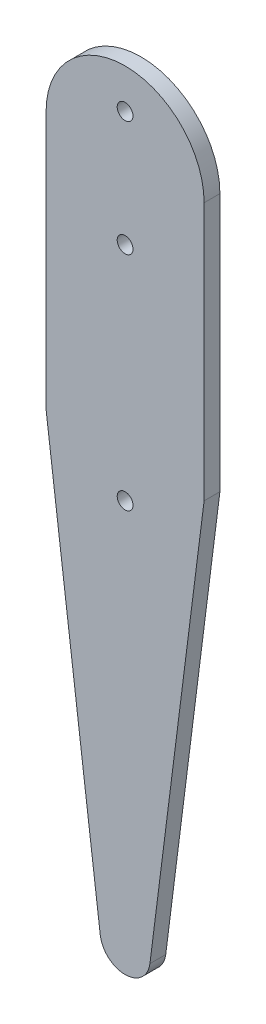
ISO-10303-21;
HEADER;
FILE_DESCRIPTION(('STEP AP214'),'2;1');
FILE_NAME('part.step','',(''),(''),'','','');
FILE_SCHEMA(('AUTOMOTIVE_DESIGN { 1 0 10303 214 1 1 1 1 }'));
ENDSEC;
DATA;
#1=APPLICATION_CONTEXT('core data for automotive mechanical design processes');
#2=APPLICATION_PROTOCOL_DEFINITION('international standard','automotive_design',2000,#1);
#3=PRODUCT_CONTEXT('',#1,'mechanical');
#4=PRODUCT('Part','Part','',(#3));
#5=PRODUCT_RELATED_PRODUCT_CATEGORY('part','',(#4));
#6=PRODUCT_DEFINITION_FORMATION('','',#4);
#7=PRODUCT_DEFINITION_CONTEXT('part definition',#1,'design');
#8=PRODUCT_DEFINITION('design','',#6,#7);
#9=PRODUCT_DEFINITION_SHAPE('','',#8);
#10=(LENGTH_UNIT() NAMED_UNIT(*) SI_UNIT(.MILLI.,.METRE.));
#11=(NAMED_UNIT(*) PLANE_ANGLE_UNIT() SI_UNIT($,.RADIAN.));
#12=(NAMED_UNIT(*) SI_UNIT($,.STERADIAN.) SOLID_ANGLE_UNIT());
#13=UNCERTAINTY_MEASURE_WITH_UNIT(LENGTH_MEASURE(1.E-05),#10,'distance_accuracy_value','');
#14=(GEOMETRIC_REPRESENTATION_CONTEXT(3) GLOBAL_UNCERTAINTY_ASSIGNED_CONTEXT((#13)) GLOBAL_UNIT_ASSIGNED_CONTEXT((#10,
#11,#12)) REPRESENTATION_CONTEXT('',''));
#15=CARTESIAN_POINT('',(0.,0.,0.));
#16=DIRECTION('',(0.,0.,1.));
#17=DIRECTION('',(1.,0.,0.));
#18=AXIS2_PLACEMENT_3D('',#15,#16,#17);
#19=CARTESIAN_POINT('',(9.99999999999545,44.7499999999967,3.));
#20=DIRECTION('',(0.,0.,1.));
#21=DIRECTION('',(1.,0.,0.));
#22=AXIS2_PLACEMENT_3D('',#19,#20,#21);
#23=PLANE('',#22);
#24=CARTESIAN_POINT('',(10.0000000000035,52.2499999999999,3.));
#25=DIRECTION('',(0.,0.,1.));
#26=DIRECTION('',(1.,0.,0.));
#27=AXIS2_PLACEMENT_3D('',#24,#25,#26);
#28=CIRCLE('',#27,1.5);
#29=CARTESIAN_POINT('',(11.5000000000035,52.2499999999999,3.));
#30=VERTEX_POINT('',#29);
#31=EDGE_CURVE('E187',#30,#30,#28,.T.);
#32=ORIENTED_EDGE('',*,*,#31,.F.);
#33=EDGE_LOOP('',(#32));
#34=FACE_BOUND('',#33,.T.);
#35=CARTESIAN_POINT('',(9.99999999999545,44.7499999999967,3.));
#36=DIRECTION('',(0.,0.,1.));
#37=DIRECTION('',(1.,0.,0.));
#38=AXIS2_PLACEMENT_3D('',#35,#36,#37);
#39=CIRCLE('',#38,14.9999999999159);
#40=CARTESIAN_POINT('',(24.999999999834,44.7499999999967,3.));
#41=VERTEX_POINT('',#40);
#42=CARTESIAN_POINT('',(-4.99999999999773,44.7499999999967,3.));
#43=VERTEX_POINT('',#42);
#44=EDGE_CURVE('E131',#41,#43,#39,.T.);
#45=ORIENTED_EDGE('',*,*,#44,.T.);
#46=DIRECTION('',(0.,-1.,0.));
#47=VECTOR('',#46,1.);
#48=CARTESIAN_POINT('',(-4.99999999999773,44.7499999999967,3.));
#49=LINE('',#48,#47);
#50=CARTESIAN_POINT('',(-4.99999999999773,-4.25000000000659,3.));
#51=VERTEX_POINT('',#50);
#52=EDGE_CURVE('E89',#43,#51,#49,.T.);
#53=ORIENTED_EDGE('',*,*,#52,.T.);
#54=DIRECTION('',(0.12563429234926,-0.992076622336148,0.));
#55=VECTOR('',#54,1.);
#56=CARTESIAN_POINT('',(-4.99999999999773,-4.25000000000659,3.));
#57=LINE('',#56,#55);
#58=CARTESIAN_POINT('',(5.28763604390686,-85.4867628886591,3.));
#59=VERTEX_POINT('',#58);
#60=EDGE_CURVE('E102',#51,#59,#57,.T.);
#61=ORIENTED_EDGE('',*,*,#60,.T.);
#62=CARTESIAN_POINT('',(10.0000000000036,-84.89,3.));
#63=DIRECTION('',(0.,0.,1.));
#64=DIRECTION('',(1.,0.,0.));
#65=AXIS2_PLACEMENT_3D('',#62,#63,#64);
#66=CIRCLE('',#65,4.75);
#67=CARTESIAN_POINT('',(14.7123639561003,-85.486762888659,3.));
#68=VERTEX_POINT('',#67);
#69=EDGE_CURVE('E96',#59,#68,#66,.T.);
#70=ORIENTED_EDGE('',*,*,#69,.T.);
#71=DIRECTION('',(0.125634292347198,0.992076622336409,0.));
#72=VECTOR('',#71,1.);
#73=CARTESIAN_POINT('',(24.9999999998328,-4.25000000000989,3.));
#74=LINE('',#73,#72);
#75=CARTESIAN_POINT('',(24.9999999998328,-4.25000000000989,3.));
#76=VERTEX_POINT('',#75);
#77=EDGE_CURVE('E100',#68,#76,#74,.T.);
#78=ORIENTED_EDGE('',*,*,#77,.T.);
#79=DIRECTION('',(0.,1.,0.));
#80=VECTOR('',#79,1.);
#81=CARTESIAN_POINT('',(24.999999999834,44.7499999999967,3.));
#82=LINE('',#81,#80);
#83=EDGE_CURVE('E52',#76,#41,#82,.T.);
#84=ORIENTED_EDGE('',*,*,#83,.T.);
#85=EDGE_LOOP('',(#45,#53,#61,#70,#78,#84));
#86=FACE_BOUND('',#85,.T.);
#87=CARTESIAN_POINT('',(9.99999999999547,30.3600000000009,3.));
#88=DIRECTION('',(0.,0.,1.));
#89=DIRECTION('',(1.,0.,0.));
#90=AXIS2_PLACEMENT_3D('',#87,#88,#89);
#91=CIRCLE('',#90,1.5);
#92=CARTESIAN_POINT('',(11.4999999999955,30.3600000000009,3.));
#93=VERTEX_POINT('',#92);
#94=EDGE_CURVE('E124',#93,#93,#91,.T.);
#95=ORIENTED_EDGE('',*,*,#94,.F.);
#96=EDGE_LOOP('',(#95));
#97=FACE_BOUND('',#96,.T.);
#98=CARTESIAN_POINT('',(10.0000000000035,-11.75,3.));
#99=DIRECTION('',(0.,0.,1.));
#100=DIRECTION('',(1.,0.,0.));
#101=AXIS2_PLACEMENT_3D('',#98,#99,#100);
#102=CIRCLE('',#101,1.5);
#103=CARTESIAN_POINT('',(11.5000000000035,-11.75,3.));
#104=VERTEX_POINT('',#103);
#105=EDGE_CURVE('E178',#104,#104,#102,.T.);
#106=ORIENTED_EDGE('',*,*,#105,.F.);
#107=EDGE_LOOP('',(#106));
#108=FACE_BOUND('',#107,.T.);
#109=ADVANCED_FACE('F35',(#34,#86,#97,#108),#23,.T.);
#110=CARTESIAN_POINT('',(9.99999999999545,44.7499999999967,0.));
#111=DIRECTION('',(0.,0.,1.));
#112=DIRECTION('',(1.,0.,0.));
#113=AXIS2_PLACEMENT_3D('',#110,#111,#112);
#114=PLANE('',#113);
#115=CARTESIAN_POINT('',(10.0000000000035,52.2499999999999,0.));
#116=DIRECTION('',(0.,0.,1.));
#117=DIRECTION('',(1.,0.,0.));
#118=AXIS2_PLACEMENT_3D('',#115,#116,#117);
#119=CIRCLE('',#118,1.5);
#120=CARTESIAN_POINT('',(11.5000000000035,52.2499999999999,0.));
#121=VERTEX_POINT('',#120);
#122=EDGE_CURVE('E184',#121,#121,#119,.T.);
#123=ORIENTED_EDGE('',*,*,#122,.T.);
#124=EDGE_LOOP('',(#123));
#125=FACE_BOUND('',#124,.T.);
#126=CARTESIAN_POINT('',(9.99999999999545,44.7499999999967,0.));
#127=DIRECTION('',(0.,0.,1.));
#128=DIRECTION('',(1.,0.,0.));
#129=AXIS2_PLACEMENT_3D('',#126,#127,#128);
#130=CIRCLE('',#129,14.9999999999159);
#131=CARTESIAN_POINT('',(24.999999999834,44.7499999999967,0.));
#132=VERTEX_POINT('',#131);
#133=CARTESIAN_POINT('',(-4.99999999999773,44.7499999999967,0.));
#134=VERTEX_POINT('',#133);
#135=EDGE_CURVE('E120',#132,#134,#130,.T.);
#136=ORIENTED_EDGE('',*,*,#135,.F.);
#137=DIRECTION('',(0.,1.,0.));
#138=VECTOR('',#137,1.);
#139=CARTESIAN_POINT('',(24.999999999834,44.7499999999967,0.));
#140=LINE('',#139,#138);
#141=CARTESIAN_POINT('',(24.9999999998328,-4.25000000000989,0.));
#142=VERTEX_POINT('',#141);
#143=EDGE_CURVE('E81',#142,#132,#140,.T.);
#144=ORIENTED_EDGE('',*,*,#143,.F.);
#145=DIRECTION('',(0.125634292347198,0.992076622336409,0.));
#146=VECTOR('',#145,1.);
#147=CARTESIAN_POINT('',(24.9999999998328,-4.25000000000989,0.));
#148=LINE('',#147,#146);
#149=CARTESIAN_POINT('',(14.7123639561003,-85.486762888659,0.));
#150=VERTEX_POINT('',#149);
#151=EDGE_CURVE('E75',#150,#142,#148,.T.);
#152=ORIENTED_EDGE('',*,*,#151,.F.);
#153=CARTESIAN_POINT('',(10.0000000000036,-84.89,0.));
#154=DIRECTION('',(0.,0.,1.));
#155=DIRECTION('',(1.,0.,0.));
#156=AXIS2_PLACEMENT_3D('',#153,#154,#155);
#157=CIRCLE('',#156,4.75);
#158=CARTESIAN_POINT('',(5.28763604390686,-85.4867628886591,0.));
#159=VERTEX_POINT('',#158);
#160=EDGE_CURVE('E110',#159,#150,#157,.T.);
#161=ORIENTED_EDGE('',*,*,#160,.F.);
#162=DIRECTION('',(0.12563429234926,-0.992076622336148,0.));
#163=VECTOR('',#162,1.);
#164=CARTESIAN_POINT('',(-4.99999999999773,-4.25000000000659,0.));
#165=LINE('',#164,#163);
#166=CARTESIAN_POINT('',(-4.99999999999773,-4.25000000000659,0.));
#167=VERTEX_POINT('',#166);
#168=EDGE_CURVE('E126',#167,#159,#165,.T.);
#169=ORIENTED_EDGE('',*,*,#168,.F.);
#170=DIRECTION('',(0.,-1.,0.));
#171=VECTOR('',#170,1.);
#172=CARTESIAN_POINT('',(-4.99999999999773,44.7499999999967,0.));
#173=LINE('',#172,#171);
#174=EDGE_CURVE('E123',#134,#167,#173,.T.);
#175=ORIENTED_EDGE('',*,*,#174,.F.);
#176=EDGE_LOOP('',(#136,#144,#152,#161,#169,#175));
#177=FACE_BOUND('',#176,.T.);
#178=CARTESIAN_POINT('',(9.99999999999547,30.3600000000009,0.));
#179=DIRECTION('',(0.,0.,1.));
#180=DIRECTION('',(1.,0.,0.));
#181=AXIS2_PLACEMENT_3D('',#178,#179,#180);
#182=CIRCLE('',#181,1.5);
#183=CARTESIAN_POINT('',(11.4999999999955,30.3600000000009,0.));
#184=VERTEX_POINT('',#183);
#185=EDGE_CURVE('E190',#184,#184,#182,.T.);
#186=ORIENTED_EDGE('',*,*,#185,.T.);
#187=EDGE_LOOP('',(#186));
#188=FACE_BOUND('',#187,.T.);
#189=CARTESIAN_POINT('',(10.0000000000035,-11.75,0.));
#190=DIRECTION('',(0.,0.,1.));
#191=DIRECTION('',(1.,0.,0.));
#192=AXIS2_PLACEMENT_3D('',#189,#190,#191);
#193=CIRCLE('',#192,1.5);
#194=CARTESIAN_POINT('',(11.5000000000035,-11.75,0.));
#195=VERTEX_POINT('',#194);
#196=EDGE_CURVE('E181',#195,#195,#193,.T.);
#197=ORIENTED_EDGE('',*,*,#196,.T.);
#198=EDGE_LOOP('',(#197));
#199=FACE_BOUND('',#198,.T.);
#200=ADVANCED_FACE('F140',(#125,#177,#188,#199),#114,.F.);
#201=CARTESIAN_POINT('',(9.99999999999545,44.7499999999967,3.));
#202=DIRECTION('',(0.,0.,-1.));
#203=DIRECTION('',(-1.,0.,0.));
#204=AXIS2_PLACEMENT_3D('',#201,#202,#203);
#205=CYLINDRICAL_SURFACE('',#204,14.9999999999159);
#206=ORIENTED_EDGE('',*,*,#135,.T.);
#207=DIRECTION('',(0.,0.,-1.));
#208=VECTOR('',#207,1.);
#209=CARTESIAN_POINT('',(-4.99999999999773,44.7499999999967,3.));
#210=LINE('',#209,#208);
#211=EDGE_CURVE('E11',#43,#134,#210,.T.);
#212=ORIENTED_EDGE('',*,*,#211,.F.);
#213=ORIENTED_EDGE('',*,*,#44,.F.);
#214=DIRECTION('',(0.,0.,-1.));
#215=VECTOR('',#214,1.);
#216=CARTESIAN_POINT('',(24.999999999834,44.7499999999967,3.));
#217=LINE('',#216,#215);
#218=EDGE_CURVE('E116',#41,#132,#217,.T.);
#219=ORIENTED_EDGE('',*,*,#218,.T.);
#220=EDGE_LOOP('',(#206,#212,#213,#219));
#221=FACE_BOUND('',#220,.T.);
#222=ADVANCED_FACE('F37',(#221),#205,.T.);
#223=CARTESIAN_POINT('',(-4.99999999999773,44.7499999999967,3.));
#224=DIRECTION('',(1.,0.,0.));
#225=DIRECTION('',(0.,0.,-1.));
#226=AXIS2_PLACEMENT_3D('',#223,#224,#225);
#227=PLANE('',#226);
#228=ORIENTED_EDGE('',*,*,#174,.T.);
#229=DIRECTION('',(0.,0.,-1.));
#230=VECTOR('',#229,1.);
#231=CARTESIAN_POINT('',(-4.99999999999773,-4.25000000000659,3.));
#232=LINE('',#231,#230);
#233=EDGE_CURVE('E44',#51,#167,#232,.T.);
#234=ORIENTED_EDGE('',*,*,#233,.F.);
#235=ORIENTED_EDGE('',*,*,#52,.F.);
#236=ORIENTED_EDGE('',*,*,#211,.T.);
#237=EDGE_LOOP('',(#228,#234,#235,#236));
#238=FACE_BOUND('',#237,.T.);
#239=ADVANCED_FACE('F239',(#238),#227,.F.);
#240=CARTESIAN_POINT('',(-4.99999999999773,-4.25000000000659,3.));
#241=DIRECTION('',(0.992076622336148,0.12563429234926,0.));
#242=DIRECTION('',(-0.12563429234926,0.992076622336148,0.));
#243=AXIS2_PLACEMENT_3D('',#240,#241,#242);
#244=PLANE('',#243);
#245=ORIENTED_EDGE('',*,*,#168,.T.);
#246=DIRECTION('',(0.,0.,-1.));
#247=VECTOR('',#246,1.);
#248=CARTESIAN_POINT('',(5.28763604390686,-85.4867628886591,3.));
#249=LINE('',#248,#247);
#250=EDGE_CURVE('E111',#59,#159,#249,.T.);
#251=ORIENTED_EDGE('',*,*,#250,.F.);
#252=ORIENTED_EDGE('',*,*,#60,.F.);
#253=ORIENTED_EDGE('',*,*,#233,.T.);
#254=EDGE_LOOP('',(#245,#251,#252,#253));
#255=FACE_BOUND('',#254,.T.);
#256=ADVANCED_FACE('F137',(#255),#244,.F.);
#257=CARTESIAN_POINT('',(10.0000000000036,-84.89,3.));
#258=DIRECTION('',(0.,0.,-1.));
#259=DIRECTION('',(-1.,0.,0.));
#260=AXIS2_PLACEMENT_3D('',#257,#258,#259);
#261=CYLINDRICAL_SURFACE('',#260,4.75);
#262=ORIENTED_EDGE('',*,*,#160,.T.);
#263=DIRECTION('',(0.,0.,-1.));
#264=VECTOR('',#263,1.);
#265=CARTESIAN_POINT('',(14.7123639561003,-85.486762888659,3.));
#266=LINE('',#265,#264);
#267=EDGE_CURVE('E107',#68,#150,#266,.T.);
#268=ORIENTED_EDGE('',*,*,#267,.F.);
#269=ORIENTED_EDGE('',*,*,#69,.F.);
#270=ORIENTED_EDGE('',*,*,#250,.T.);
#271=EDGE_LOOP('',(#262,#268,#269,#270));
#272=FACE_BOUND('',#271,.T.);
#273=ADVANCED_FACE('F108',(#272),#261,.T.);
#274=CARTESIAN_POINT('',(24.9999999998328,-4.25000000000989,3.));
#275=DIRECTION('',(-0.992076622336409,0.125634292347198,0.));
#276=DIRECTION('',(-0.125634292347198,-0.99207662233641,0.));
#277=AXIS2_PLACEMENT_3D('',#274,#275,#276);
#278=PLANE('',#277);
#279=ORIENTED_EDGE('',*,*,#151,.T.);
#280=DIRECTION('',(0.,0.,-1.));
#281=VECTOR('',#280,1.);
#282=CARTESIAN_POINT('',(24.9999999998328,-4.25000000000989,3.));
#283=LINE('',#282,#281);
#284=EDGE_CURVE('E112',#76,#142,#283,.T.);
#285=ORIENTED_EDGE('',*,*,#284,.F.);
#286=ORIENTED_EDGE('',*,*,#77,.F.);
#287=ORIENTED_EDGE('',*,*,#267,.T.);
#288=EDGE_LOOP('',(#279,#285,#286,#287));
#289=FACE_BOUND('',#288,.T.);
#290=ADVANCED_FACE('F114',(#289),#278,.F.);
#291=CARTESIAN_POINT('',(24.999999999834,44.7499999999967,3.));
#292=DIRECTION('',(-1.,0.,0.));
#293=DIRECTION('',(0.,-1.,0.));
#294=AXIS2_PLACEMENT_3D('',#291,#292,#293);
#295=PLANE('',#294);
#296=ORIENTED_EDGE('',*,*,#143,.T.);
#297=ORIENTED_EDGE('',*,*,#218,.F.);
#298=ORIENTED_EDGE('',*,*,#83,.F.);
#299=ORIENTED_EDGE('',*,*,#284,.T.);
#300=EDGE_LOOP('',(#296,#297,#298,#299));
#301=FACE_BOUND('',#300,.T.);
#302=ADVANCED_FACE('F145',(#301),#295,.F.);
#303=CARTESIAN_POINT('',(9.99999999999547,30.3600000000009,3.));
#304=DIRECTION('',(0.,0.,-1.));
#305=DIRECTION('',(-1.,0.,0.));
#306=AXIS2_PLACEMENT_3D('',#303,#304,#305);
#307=CYLINDRICAL_SURFACE('',#306,1.5);
#308=ORIENTED_EDGE('',*,*,#94,.T.);
#309=EDGE_LOOP('',(#308));
#310=FACE_BOUND('',#309,.T.);
#311=ORIENTED_EDGE('',*,*,#185,.F.);
#312=EDGE_LOOP('',(#311));
#313=FACE_BOUND('',#312,.T.);
#314=ADVANCED_FACE('F147',(#310,#313),#307,.F.);
#315=CARTESIAN_POINT('',(10.0000000000035,52.2499999999999,3.));
#316=DIRECTION('',(0.,0.,-1.));
#317=DIRECTION('',(-1.,0.,0.));
#318=AXIS2_PLACEMENT_3D('',#315,#316,#317);
#319=CYLINDRICAL_SURFACE('',#318,1.5);
#320=ORIENTED_EDGE('',*,*,#31,.T.);
#321=EDGE_LOOP('',(#320));
#322=FACE_BOUND('',#321,.T.);
#323=ORIENTED_EDGE('',*,*,#122,.F.);
#324=EDGE_LOOP('',(#323));
#325=FACE_BOUND('',#324,.T.);
#326=ADVANCED_FACE('F153',(#322,#325),#319,.F.);
#327=CARTESIAN_POINT('',(10.0000000000035,-11.75,3.));
#328=DIRECTION('',(0.,0.,-1.));
#329=DIRECTION('',(-1.,0.,0.));
#330=AXIS2_PLACEMENT_3D('',#327,#328,#329);
#331=CYLINDRICAL_SURFACE('',#330,1.5);
#332=ORIENTED_EDGE('',*,*,#105,.T.);
#333=EDGE_LOOP('',(#332));
#334=FACE_BOUND('',#333,.T.);
#335=ORIENTED_EDGE('',*,*,#196,.F.);
#336=EDGE_LOOP('',(#335));
#337=FACE_BOUND('',#336,.T.);
#338=ADVANCED_FACE('F169',(#334,#337),#331,.F.);
#339=CLOSED_SHELL('',(#109,#200,#222,#239,#256,#273,#290,#302,#314,#326,#338));
#340=MANIFOLD_SOLID_BREP('B2',#339);
#341=ADVANCED_BREP_SHAPE_REPRESENTATION('',(#18,#340),#14);
#342=SHAPE_DEFINITION_REPRESENTATION(#9,#341);
ENDSEC;
END-ISO-10303-21;
